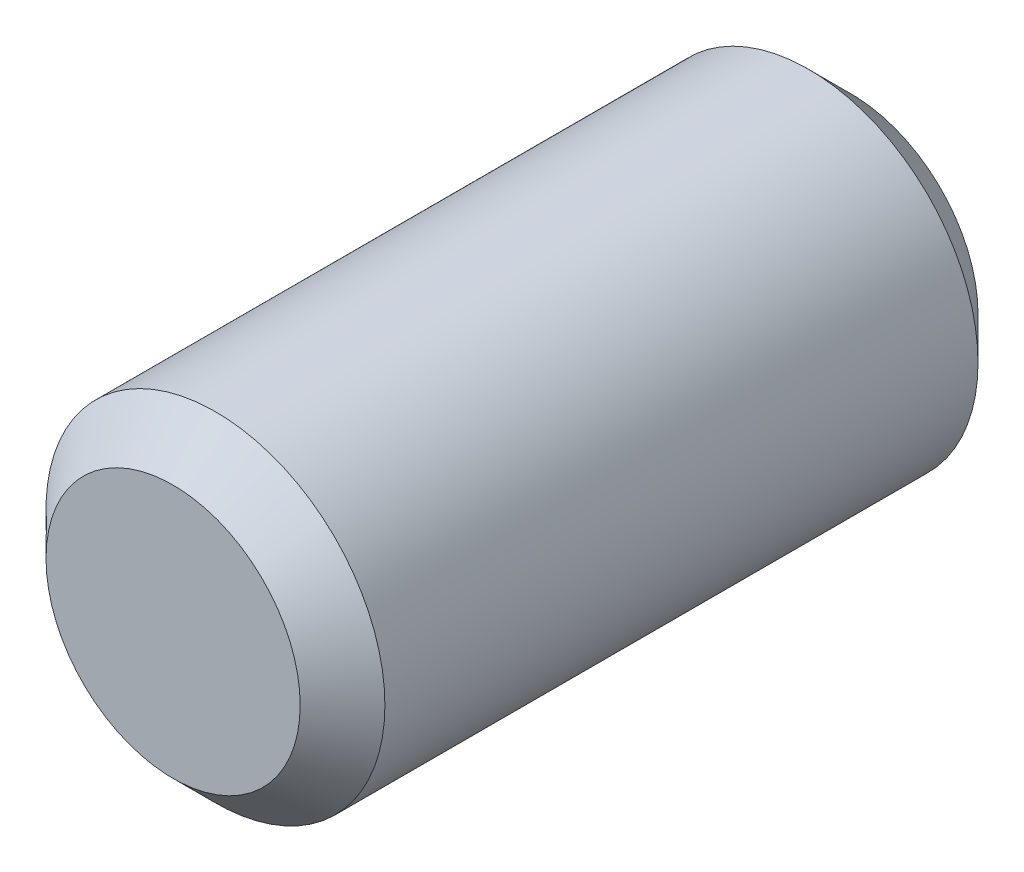
ISO-10303-21;
HEADER;
FILE_DESCRIPTION(('STEP AP214'),'2;1');
FILE_NAME('part.step','',(''),(''),'','','');
FILE_SCHEMA(('AUTOMOTIVE_DESIGN { 1 0 10303 214 1 1 1 1 }'));
ENDSEC;
DATA;
#1=APPLICATION_CONTEXT('core data for automotive mechanical design processes');
#2=APPLICATION_PROTOCOL_DEFINITION('international standard','automotive_design',2000,#1);
#3=PRODUCT_CONTEXT('',#1,'mechanical');
#4=PRODUCT('Part','Part','',(#3));
#5=PRODUCT_RELATED_PRODUCT_CATEGORY('part','',(#4));
#6=PRODUCT_DEFINITION_FORMATION('','',#4);
#7=PRODUCT_DEFINITION_CONTEXT('part definition',#1,'design');
#8=PRODUCT_DEFINITION('design','',#6,#7);
#9=PRODUCT_DEFINITION_SHAPE('','',#8);
#10=(LENGTH_UNIT() NAMED_UNIT(*) SI_UNIT(.MILLI.,.METRE.));
#11=(NAMED_UNIT(*) PLANE_ANGLE_UNIT() SI_UNIT($,.RADIAN.));
#12=(NAMED_UNIT(*) SI_UNIT($,.STERADIAN.) SOLID_ANGLE_UNIT());
#13=UNCERTAINTY_MEASURE_WITH_UNIT(LENGTH_MEASURE(1.E-05),#10,'distance_accuracy_value','');
#14=(GEOMETRIC_REPRESENTATION_CONTEXT(3) GLOBAL_UNCERTAINTY_ASSIGNED_CONTEXT((#13)) GLOBAL_UNIT_ASSIGNED_CONTEXT((#10,
#11,#12)) REPRESENTATION_CONTEXT('',''));
#15=CARTESIAN_POINT('',(0.,0.,0.));
#16=DIRECTION('',(0.,0.,1.));
#17=DIRECTION('',(1.,0.,0.));
#18=AXIS2_PLACEMENT_3D('',#15,#16,#17);
#19=CARTESIAN_POINT('',(0.,0.,4.));
#20=DIRECTION('',(0.,0.,-1.));
#21=DIRECTION('',(-1.,0.,0.));
#22=AXIS2_PLACEMENT_3D('',#19,#20,#21);
#23=CYLINDRICAL_SURFACE('',#22,2.);
#24=CARTESIAN_POINT('',(0.,0.,-3.5));
#25=DIRECTION('',(0.,0.,1.));
#26=DIRECTION('',(1.,0.,0.));
#27=AXIS2_PLACEMENT_3D('',#24,#25,#26);
#28=CIRCLE('',#27,2.);
#29=CARTESIAN_POINT('',(2.,0.,-3.5));
#30=VERTEX_POINT('',#29);
#31=EDGE_CURVE('E41',#30,#30,#28,.T.);
#32=ORIENTED_EDGE('',*,*,#31,.T.);
#33=EDGE_LOOP('',(#32));
#34=FACE_BOUND('',#33,.T.);
#35=CARTESIAN_POINT('',(0.,0.,3.5));
#36=DIRECTION('',(0.,0.,1.));
#37=DIRECTION('',(1.,0.,0.));
#38=AXIS2_PLACEMENT_3D('',#35,#36,#37);
#39=CIRCLE('',#38,2.);
#40=CARTESIAN_POINT('',(2.,0.,3.5));
#41=VERTEX_POINT('',#40);
#42=EDGE_CURVE('E45',#41,#41,#39,.F.);
#43=ORIENTED_EDGE('',*,*,#42,.T.);
#44=EDGE_LOOP('',(#43));
#45=FACE_BOUND('',#44,.T.);
#46=ADVANCED_FACE('F30',(#34,#45),#23,.T.);
#47=CARTESIAN_POINT('',(0.,0.,4.));
#48=DIRECTION('',(0.,0.,1.));
#49=DIRECTION('',(1.,0.,0.));
#50=AXIS2_PLACEMENT_3D('',#47,#48,#49);
#51=PLANE('',#50);
#52=CARTESIAN_POINT('',(0.,0.,4.));
#53=DIRECTION('',(0.,0.,1.));
#54=DIRECTION('',(1.,0.,0.));
#55=AXIS2_PLACEMENT_3D('',#52,#53,#54);
#56=CIRCLE('',#55,1.5);
#57=CARTESIAN_POINT('',(1.5,0.,4.));
#58=VERTEX_POINT('',#57);
#59=EDGE_CURVE('E10',#58,#58,#56,.T.);
#60=ORIENTED_EDGE('',*,*,#59,.T.);
#61=EDGE_LOOP('',(#60));
#62=FACE_BOUND('',#61,.T.);
#63=ADVANCED_FACE('F61',(#62),#51,.T.);
#64=CARTESIAN_POINT('',(0.,0.,-4.));
#65=DIRECTION('',(0.,0.,1.));
#66=DIRECTION('',(1.,0.,0.));
#67=AXIS2_PLACEMENT_3D('',#64,#65,#66);
#68=PLANE('',#67);
#69=CARTESIAN_POINT('',(0.,0.,-4.));
#70=DIRECTION('',(0.,0.,1.));
#71=DIRECTION('',(1.,0.,0.));
#72=AXIS2_PLACEMENT_3D('',#69,#70,#71);
#73=CIRCLE('',#72,1.5);
#74=CARTESIAN_POINT('',(1.5,0.,-4.));
#75=VERTEX_POINT('',#74);
#76=EDGE_CURVE('E37',#75,#75,#73,.F.);
#77=ORIENTED_EDGE('',*,*,#76,.T.);
#78=EDGE_LOOP('',(#77));
#79=FACE_BOUND('',#78,.T.);
#80=ADVANCED_FACE('F58',(#79),#68,.F.);
#81=CARTESIAN_POINT('',(0.,0.,-3.5));
#82=DIRECTION('',(0.,0.,1.));
#83=DIRECTION('',(1.,0.,0.));
#84=AXIS2_PLACEMENT_3D('',#81,#82,#83);
#85=CONICAL_SURFACE('',#84,2.,0.785398163397451);
#86=ORIENTED_EDGE('',*,*,#76,.F.);
#87=EDGE_LOOP('',(#86));
#88=FACE_BOUND('',#87,.T.);
#89=ORIENTED_EDGE('',*,*,#31,.F.);
#90=EDGE_LOOP('',(#89));
#91=FACE_BOUND('',#90,.T.);
#92=ADVANCED_FACE('F54',(#88,#91),#85,.T.);
#93=CARTESIAN_POINT('',(0.,0.,4.));
#94=DIRECTION('',(0.,0.,-1.));
#95=DIRECTION('',(-1.,0.,0.));
#96=AXIS2_PLACEMENT_3D('',#93,#94,#95);
#97=CONICAL_SURFACE('',#96,1.5,0.785398163397446);
#98=ORIENTED_EDGE('',*,*,#42,.F.);
#99=EDGE_LOOP('',(#98));
#100=FACE_BOUND('',#99,.T.);
#101=ORIENTED_EDGE('',*,*,#59,.F.);
#102=EDGE_LOOP('',(#101));
#103=FACE_BOUND('',#102,.T.);
#104=ADVANCED_FACE('F32',(#100,#103),#97,.T.);
#105=CLOSED_SHELL('',(#46,#63,#80,#92,#104));
#106=MANIFOLD_SOLID_BREP('B2',#105);
#107=ADVANCED_BREP_SHAPE_REPRESENTATION('',(#18,#106),#14);
#108=SHAPE_DEFINITION_REPRESENTATION(#9,#107);
ENDSEC;
END-ISO-10303-21;
